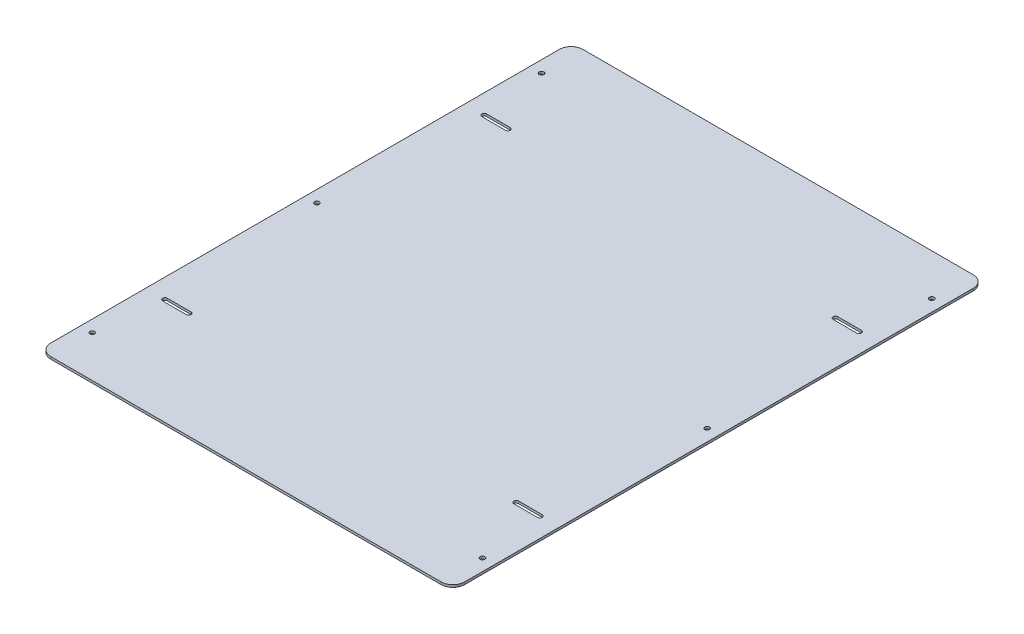
ISO-10303-21;
HEADER;
FILE_DESCRIPTION(('STEP AP214'),'2;1');
FILE_NAME('part.step','',(''),(''),'','','');
FILE_SCHEMA(('AUTOMOTIVE_DESIGN { 1 0 10303 214 1 1 1 1 }'));
ENDSEC;
DATA;
#1=APPLICATION_CONTEXT('core data for automotive mechanical design processes');
#2=APPLICATION_PROTOCOL_DEFINITION('international standard','automotive_design',2000,#1);
#3=PRODUCT_CONTEXT('',#1,'mechanical');
#4=PRODUCT('Part','Part','',(#3));
#5=PRODUCT_RELATED_PRODUCT_CATEGORY('part','',(#4));
#6=PRODUCT_DEFINITION_FORMATION('','',#4);
#7=PRODUCT_DEFINITION_CONTEXT('part definition',#1,'design');
#8=PRODUCT_DEFINITION('design','',#6,#7);
#9=PRODUCT_DEFINITION_SHAPE('','',#8);
#10=(LENGTH_UNIT() NAMED_UNIT(*) SI_UNIT(.MILLI.,.METRE.));
#11=(NAMED_UNIT(*) PLANE_ANGLE_UNIT() SI_UNIT($,.RADIAN.));
#12=(NAMED_UNIT(*) SI_UNIT($,.STERADIAN.) SOLID_ANGLE_UNIT());
#13=UNCERTAINTY_MEASURE_WITH_UNIT(LENGTH_MEASURE(1.E-05),#10,'distance_accuracy_value','');
#14=(GEOMETRIC_REPRESENTATION_CONTEXT(3) GLOBAL_UNCERTAINTY_ASSIGNED_CONTEXT((#13)) GLOBAL_UNIT_ASSIGNED_CONTEXT((#10,
#11,#12)) REPRESENTATION_CONTEXT('',''));
#15=CARTESIAN_POINT('',(0.,0.,0.));
#16=DIRECTION('',(0.,0.,1.));
#17=DIRECTION('',(1.,0.,0.));
#18=AXIS2_PLACEMENT_3D('',#15,#16,#17);
#19=CARTESIAN_POINT('',(-165.,-2.,215.));
#20=DIRECTION('',(0.,1.,0.));
#21=DIRECTION('',(0.,0.,1.));
#22=AXIS2_PLACEMENT_3D('',#19,#20,#21);
#23=CYLINDRICAL_SURFACE('',#22,9.99999999999999);
#24=CARTESIAN_POINT('',(-165.,0.,215.));
#25=DIRECTION('',(0.,1.,0.));
#26=DIRECTION('',(0.,0.,1.));
#27=AXIS2_PLACEMENT_3D('',#24,#25,#26);
#28=CIRCLE('',#27,9.99999999999999);
#29=CARTESIAN_POINT('',(-175.,0.,215.));
#30=VERTEX_POINT('',#29);
#31=CARTESIAN_POINT('',(-165.,0.,225.));
#32=VERTEX_POINT('',#31);
#33=EDGE_CURVE('E364',#30,#32,#28,.T.);
#34=ORIENTED_EDGE('',*,*,#33,.F.);
#35=DIRECTION('',(0.,1.,0.));
#36=VECTOR('',#35,1.);
#37=CARTESIAN_POINT('',(-175.,-2.,215.));
#38=LINE('',#37,#36);
#39=CARTESIAN_POINT('',(-175.,-2.,215.));
#40=VERTEX_POINT('',#39);
#41=EDGE_CURVE('E11',#40,#30,#38,.T.);
#42=ORIENTED_EDGE('',*,*,#41,.F.);
#43=CARTESIAN_POINT('',(-165.,-2.,215.));
#44=DIRECTION('',(0.,1.,0.));
#45=DIRECTION('',(0.,0.,1.));
#46=AXIS2_PLACEMENT_3D('',#43,#44,#45);
#47=CIRCLE('',#46,9.99999999999999);
#48=CARTESIAN_POINT('',(-165.,-2.,225.));
#49=VERTEX_POINT('',#48);
#50=EDGE_CURVE('E367',#40,#49,#47,.T.);
#51=ORIENTED_EDGE('',*,*,#50,.T.);
#52=DIRECTION('',(0.,1.,0.));
#53=VECTOR('',#52,1.);
#54=CARTESIAN_POINT('',(-165.,-2.,225.));
#55=LINE('',#54,#53);
#56=EDGE_CURVE('E40',#49,#32,#55,.T.);
#57=ORIENTED_EDGE('',*,*,#56,.T.);
#58=EDGE_LOOP('',(#34,#42,#51,#57));
#59=FACE_BOUND('',#58,.T.);
#60=ADVANCED_FACE('F37',(#59),#23,.T.);
#61=CARTESIAN_POINT('',(-175.,-2.,-215.));
#62=DIRECTION('',(-1.,0.,0.));
#63=DIRECTION('',(0.,0.,1.));
#64=AXIS2_PLACEMENT_3D('',#61,#62,#63);
#65=PLANE('',#64);
#66=DIRECTION('',(0.,0.,1.));
#67=VECTOR('',#66,1.);
#68=CARTESIAN_POINT('',(-175.,0.,-215.));
#69=LINE('',#68,#67);
#70=CARTESIAN_POINT('',(-175.,0.,-215.));
#71=VERTEX_POINT('',#70);
#72=EDGE_CURVE('E371',#71,#30,#69,.T.);
#73=ORIENTED_EDGE('',*,*,#72,.F.);
#74=DIRECTION('',(0.,1.,0.));
#75=VECTOR('',#74,1.);
#76=CARTESIAN_POINT('',(-175.,-2.,-215.));
#77=LINE('',#76,#75);
#78=CARTESIAN_POINT('',(-175.,-2.,-215.));
#79=VERTEX_POINT('',#78);
#80=EDGE_CURVE('E45',#79,#71,#77,.T.);
#81=ORIENTED_EDGE('',*,*,#80,.F.);
#82=DIRECTION('',(0.,0.,1.));
#83=VECTOR('',#82,1.);
#84=CARTESIAN_POINT('',(-175.,-2.,-215.));
#85=LINE('',#84,#83);
#86=EDGE_CURVE('E389',#79,#40,#85,.T.);
#87=ORIENTED_EDGE('',*,*,#86,.T.);
#88=ORIENTED_EDGE('',*,*,#41,.T.);
#89=EDGE_LOOP('',(#73,#81,#87,#88));
#90=FACE_BOUND('',#89,.T.);
#91=ADVANCED_FACE('F436',(#90),#65,.T.);
#92=CARTESIAN_POINT('',(-165.,-2.,-215.));
#93=DIRECTION('',(0.,1.,0.));
#94=DIRECTION('',(0.,0.,1.));
#95=AXIS2_PLACEMENT_3D('',#92,#93,#94);
#96=CYLINDRICAL_SURFACE('',#95,10.);
#97=CARTESIAN_POINT('',(-165.,0.,-215.));
#98=DIRECTION('',(0.,1.,0.));
#99=DIRECTION('',(0.,0.,1.));
#100=AXIS2_PLACEMENT_3D('',#97,#98,#99);
#101=CIRCLE('',#100,10.);
#102=CARTESIAN_POINT('',(-165.,0.,-225.));
#103=VERTEX_POINT('',#102);
#104=EDGE_CURVE('E409',#103,#71,#101,.T.);
#105=ORIENTED_EDGE('',*,*,#104,.F.);
#106=DIRECTION('',(0.,1.,0.));
#107=VECTOR('',#106,1.);
#108=CARTESIAN_POINT('',(-165.,-2.,-225.));
#109=LINE('',#108,#107);
#110=CARTESIAN_POINT('',(-165.,-2.,-225.));
#111=VERTEX_POINT('',#110);
#112=EDGE_CURVE('E415',#111,#103,#109,.T.);
#113=ORIENTED_EDGE('',*,*,#112,.F.);
#114=CARTESIAN_POINT('',(-165.,-2.,-215.));
#115=DIRECTION('',(0.,1.,0.));
#116=DIRECTION('',(0.,0.,1.));
#117=AXIS2_PLACEMENT_3D('',#114,#115,#116);
#118=CIRCLE('',#117,10.);
#119=EDGE_CURVE('E386',#111,#79,#118,.T.);
#120=ORIENTED_EDGE('',*,*,#119,.T.);
#121=ORIENTED_EDGE('',*,*,#80,.T.);
#122=EDGE_LOOP('',(#105,#113,#120,#121));
#123=FACE_BOUND('',#122,.T.);
#124=ADVANCED_FACE('F456',(#123),#96,.T.);
#125=CARTESIAN_POINT('',(-165.,-2.,-225.));
#126=DIRECTION('',(0.,0.,-1.));
#127=DIRECTION('',(-1.,0.,0.));
#128=AXIS2_PLACEMENT_3D('',#125,#126,#127);
#129=PLANE('',#128);
#130=DIRECTION('',(-1.,0.,0.));
#131=VECTOR('',#130,1.);
#132=CARTESIAN_POINT('',(-165.,0.,-225.));
#133=LINE('',#132,#131);
#134=CARTESIAN_POINT('',(165.,0.,-225.));
#135=VERTEX_POINT('',#134);
#136=EDGE_CURVE('E406',#135,#103,#133,.T.);
#137=ORIENTED_EDGE('',*,*,#136,.F.);
#138=DIRECTION('',(0.,1.,0.));
#139=VECTOR('',#138,1.);
#140=CARTESIAN_POINT('',(165.,-2.,-225.));
#141=LINE('',#140,#139);
#142=CARTESIAN_POINT('',(165.,-2.,-225.));
#143=VERTEX_POINT('',#142);
#144=EDGE_CURVE('E417',#143,#135,#141,.T.);
#145=ORIENTED_EDGE('',*,*,#144,.F.);
#146=DIRECTION('',(-1.,0.,0.));
#147=VECTOR('',#146,1.);
#148=CARTESIAN_POINT('',(-165.,-2.,-225.));
#149=LINE('',#148,#147);
#150=EDGE_CURVE('E383',#143,#111,#149,.T.);
#151=ORIENTED_EDGE('',*,*,#150,.T.);
#152=ORIENTED_EDGE('',*,*,#112,.T.);
#153=EDGE_LOOP('',(#137,#145,#151,#152));
#154=FACE_BOUND('',#153,.T.);
#155=ADVANCED_FACE('F454',(#154),#129,.T.);
#156=CARTESIAN_POINT('',(165.,-2.,-215.));
#157=DIRECTION('',(0.,1.,0.));
#158=DIRECTION('',(0.,0.,1.));
#159=AXIS2_PLACEMENT_3D('',#156,#157,#158);
#160=CYLINDRICAL_SURFACE('',#159,10.);
#161=CARTESIAN_POINT('',(165.,0.,-215.));
#162=DIRECTION('',(0.,1.,0.));
#163=DIRECTION('',(0.,0.,-1.));
#164=AXIS2_PLACEMENT_3D('',#161,#162,#163);
#165=CIRCLE('',#164,10.);
#166=CARTESIAN_POINT('',(175.,0.,-215.));
#167=VERTEX_POINT('',#166);
#168=EDGE_CURVE('E403',#167,#135,#165,.T.);
#169=ORIENTED_EDGE('',*,*,#168,.F.);
#170=DIRECTION('',(0.,1.,0.));
#171=VECTOR('',#170,1.);
#172=CARTESIAN_POINT('',(175.,-2.,-215.));
#173=LINE('',#172,#171);
#174=CARTESIAN_POINT('',(175.,-2.,-215.));
#175=VERTEX_POINT('',#174);
#176=EDGE_CURVE('E419',#175,#167,#173,.T.);
#177=ORIENTED_EDGE('',*,*,#176,.F.);
#178=CARTESIAN_POINT('',(165.,-2.,-215.));
#179=DIRECTION('',(0.,1.,0.));
#180=DIRECTION('',(0.,0.,-1.));
#181=AXIS2_PLACEMENT_3D('',#178,#179,#180);
#182=CIRCLE('',#181,10.);
#183=EDGE_CURVE('E380',#175,#143,#182,.T.);
#184=ORIENTED_EDGE('',*,*,#183,.T.);
#185=ORIENTED_EDGE('',*,*,#144,.T.);
#186=EDGE_LOOP('',(#169,#177,#184,#185));
#187=FACE_BOUND('',#186,.T.);
#188=ADVANCED_FACE('F450',(#187),#160,.T.);
#189=CARTESIAN_POINT('',(175.,-2.,-215.));
#190=DIRECTION('',(1.,0.,0.));
#191=DIRECTION('',(0.,0.,-1.));
#192=AXIS2_PLACEMENT_3D('',#189,#190,#191);
#193=PLANE('',#192);
#194=DIRECTION('',(0.,0.,-1.));
#195=VECTOR('',#194,1.);
#196=CARTESIAN_POINT('',(175.,0.,-215.));
#197=LINE('',#196,#195);
#198=CARTESIAN_POINT('',(175.,0.,215.));
#199=VERTEX_POINT('',#198);
#200=EDGE_CURVE('E400',#199,#167,#197,.T.);
#201=ORIENTED_EDGE('',*,*,#200,.F.);
#202=DIRECTION('',(0.,1.,0.));
#203=VECTOR('',#202,1.);
#204=CARTESIAN_POINT('',(175.,-2.,215.));
#205=LINE('',#204,#203);
#206=CARTESIAN_POINT('',(175.,-2.,215.));
#207=VERTEX_POINT('',#206);
#208=EDGE_CURVE('E421',#207,#199,#205,.T.);
#209=ORIENTED_EDGE('',*,*,#208,.F.);
#210=DIRECTION('',(0.,0.,-1.));
#211=VECTOR('',#210,1.);
#212=CARTESIAN_POINT('',(175.,-2.,-215.));
#213=LINE('',#212,#211);
#214=EDGE_CURVE('E377',#207,#175,#213,.T.);
#215=ORIENTED_EDGE('',*,*,#214,.T.);
#216=ORIENTED_EDGE('',*,*,#176,.T.);
#217=EDGE_LOOP('',(#201,#209,#215,#216));
#218=FACE_BOUND('',#217,.T.);
#219=ADVANCED_FACE('F448',(#218),#193,.T.);
#220=CARTESIAN_POINT('',(165.,-2.,215.));
#221=DIRECTION('',(0.,1.,0.));
#222=DIRECTION('',(0.,0.,1.));
#223=AXIS2_PLACEMENT_3D('',#220,#221,#222);
#224=CYLINDRICAL_SURFACE('',#223,10.);
#225=CARTESIAN_POINT('',(165.,0.,215.));
#226=DIRECTION('',(0.,1.,0.));
#227=DIRECTION('',(0.,0.,1.));
#228=AXIS2_PLACEMENT_3D('',#225,#226,#227);
#229=CIRCLE('',#228,10.);
#230=CARTESIAN_POINT('',(165.,0.,225.));
#231=VERTEX_POINT('',#230);
#232=EDGE_CURVE('E397',#231,#199,#229,.T.);
#233=ORIENTED_EDGE('',*,*,#232,.F.);
#234=DIRECTION('',(0.,1.,0.));
#235=VECTOR('',#234,1.);
#236=CARTESIAN_POINT('',(165.,-2.,225.));
#237=LINE('',#236,#235);
#238=CARTESIAN_POINT('',(165.,-2.,225.));
#239=VERTEX_POINT('',#238);
#240=EDGE_CURVE('E422',#239,#231,#237,.T.);
#241=ORIENTED_EDGE('',*,*,#240,.F.);
#242=CARTESIAN_POINT('',(165.,-2.,215.));
#243=DIRECTION('',(0.,1.,0.));
#244=DIRECTION('',(0.,0.,1.));
#245=AXIS2_PLACEMENT_3D('',#242,#243,#244);
#246=CIRCLE('',#245,10.);
#247=EDGE_CURVE('E374',#239,#207,#246,.T.);
#248=ORIENTED_EDGE('',*,*,#247,.T.);
#249=ORIENTED_EDGE('',*,*,#208,.T.);
#250=EDGE_LOOP('',(#233,#241,#248,#249));
#251=FACE_BOUND('',#250,.T.);
#252=ADVANCED_FACE('F444',(#251),#224,.T.);
#253=CARTESIAN_POINT('',(-165.,-2.,225.));
#254=DIRECTION('',(0.,0.,1.));
#255=DIRECTION('',(1.,0.,0.));
#256=AXIS2_PLACEMENT_3D('',#253,#254,#255);
#257=PLANE('',#256);
#258=DIRECTION('',(1.,0.,0.));
#259=VECTOR('',#258,1.);
#260=CARTESIAN_POINT('',(-165.,0.,225.));
#261=LINE('',#260,#259);
#262=EDGE_CURVE('E394',#32,#231,#261,.T.);
#263=ORIENTED_EDGE('',*,*,#262,.F.);
#264=ORIENTED_EDGE('',*,*,#56,.F.);
#265=DIRECTION('',(1.,0.,0.));
#266=VECTOR('',#265,1.);
#267=CARTESIAN_POINT('',(-165.,-2.,225.));
#268=LINE('',#267,#266);
#269=EDGE_CURVE('E370',#49,#239,#268,.T.);
#270=ORIENTED_EDGE('',*,*,#269,.T.);
#271=ORIENTED_EDGE('',*,*,#240,.T.);
#272=EDGE_LOOP('',(#263,#264,#270,#271));
#273=FACE_BOUND('',#272,.T.);
#274=ADVANCED_FACE('F430',(#273),#257,.T.);
#275=CARTESIAN_POINT('',(-165.,-2.,215.));
#276=DIRECTION('',(0.,1.,0.));
#277=DIRECTION('',(0.,0.,1.));
#278=AXIS2_PLACEMENT_3D('',#275,#276,#277);
#279=PLANE('',#278);
#280=DIRECTION('',(-1.,0.,0.));
#281=VECTOR('',#280,1.);
#282=CARTESIAN_POINT('',(138.5,-2.,133.));
#283=LINE('',#282,#281);
#284=CARTESIAN_POINT('',(158.5,-2.,133.));
#285=VERTEX_POINT('',#284);
#286=CARTESIAN_POINT('',(138.5,-2.,133.));
#287=VERTEX_POINT('',#286);
#288=EDGE_CURVE('E206',#285,#287,#283,.T.);
#289=ORIENTED_EDGE('',*,*,#288,.T.);
#290=CARTESIAN_POINT('',(138.5,-2.,135.));
#291=DIRECTION('',(0.,1.,0.));
#292=DIRECTION('',(0.,0.,-1.));
#293=AXIS2_PLACEMENT_3D('',#290,#291,#292);
#294=CIRCLE('',#293,2.);
#295=CARTESIAN_POINT('',(138.5,-2.,137.));
#296=VERTEX_POINT('',#295);
#297=EDGE_CURVE('E200',#287,#296,#294,.T.);
#298=ORIENTED_EDGE('',*,*,#297,.T.);
#299=DIRECTION('',(1.,0.,0.));
#300=VECTOR('',#299,1.);
#301=CARTESIAN_POINT('',(138.5,-2.,137.));
#302=LINE('',#301,#300);
#303=CARTESIAN_POINT('',(158.5,-2.,137.));
#304=VERTEX_POINT('',#303);
#305=EDGE_CURVE('E209',#296,#304,#302,.T.);
#306=ORIENTED_EDGE('',*,*,#305,.T.);
#307=CARTESIAN_POINT('',(158.5,-2.,135.));
#308=DIRECTION('',(0.,1.,0.));
#309=DIRECTION('',(0.,0.,-1.));
#310=AXIS2_PLACEMENT_3D('',#307,#308,#309);
#311=CIRCLE('',#310,2.);
#312=EDGE_CURVE('E53',#304,#285,#311,.T.);
#313=ORIENTED_EDGE('',*,*,#312,.T.);
#314=EDGE_LOOP('',(#289,#298,#306,#313));
#315=FACE_BOUND('',#314,.T.);
#316=DIRECTION('',(-1.,0.,0.));
#317=VECTOR('',#316,1.);
#318=CARTESIAN_POINT('',(-158.5,-2.,133.));
#319=LINE('',#318,#317);
#320=CARTESIAN_POINT('',(-138.5,-2.,133.));
#321=VERTEX_POINT('',#320);
#322=CARTESIAN_POINT('',(-158.5,-2.,133.));
#323=VERTEX_POINT('',#322);
#324=EDGE_CURVE('E245',#321,#323,#319,.T.);
#325=ORIENTED_EDGE('',*,*,#324,.T.);
#326=CARTESIAN_POINT('',(-158.5,-2.,135.));
#327=DIRECTION('',(0.,1.,0.));
#328=DIRECTION('',(0.,0.,-1.));
#329=AXIS2_PLACEMENT_3D('',#326,#327,#328);
#330=CIRCLE('',#329,1.99999999999997);
#331=CARTESIAN_POINT('',(-158.5,-2.,137.));
#332=VERTEX_POINT('',#331);
#333=EDGE_CURVE('E235',#323,#332,#330,.T.);
#334=ORIENTED_EDGE('',*,*,#333,.T.);
#335=DIRECTION('',(1.,0.,0.));
#336=VECTOR('',#335,1.);
#337=CARTESIAN_POINT('',(-158.5,-2.,137.));
#338=LINE('',#337,#336);
#339=CARTESIAN_POINT('',(-138.5,-2.,137.));
#340=VERTEX_POINT('',#339);
#341=EDGE_CURVE('E238',#332,#340,#338,.T.);
#342=ORIENTED_EDGE('',*,*,#341,.T.);
#343=CARTESIAN_POINT('',(-138.5,-2.,135.));
#344=DIRECTION('',(0.,1.,0.));
#345=DIRECTION('',(0.,0.,-1.));
#346=AXIS2_PLACEMENT_3D('',#343,#344,#345);
#347=CIRCLE('',#346,1.99999999999997);
#348=EDGE_CURVE('E242',#340,#321,#347,.T.);
#349=ORIENTED_EDGE('',*,*,#348,.T.);
#350=EDGE_LOOP('',(#325,#334,#342,#349));
#351=FACE_BOUND('',#350,.T.);
#352=DIRECTION('',(-1.,0.,0.));
#353=VECTOR('',#352,1.);
#354=CARTESIAN_POINT('',(138.5,-2.,-137.));
#355=LINE('',#354,#353);
#356=CARTESIAN_POINT('',(158.5,-2.,-137.));
#357=VERTEX_POINT('',#356);
#358=CARTESIAN_POINT('',(138.5,-2.,-137.));
#359=VERTEX_POINT('',#358);
#360=EDGE_CURVE('E277',#357,#359,#355,.T.);
#361=ORIENTED_EDGE('',*,*,#360,.T.);
#362=CARTESIAN_POINT('',(138.5,-2.,-135.));
#363=DIRECTION('',(0.,1.,0.));
#364=DIRECTION('',(0.,0.,1.));
#365=AXIS2_PLACEMENT_3D('',#362,#363,#364);
#366=CIRCLE('',#365,2.);
#367=CARTESIAN_POINT('',(138.5,-2.,-133.));
#368=VERTEX_POINT('',#367);
#369=EDGE_CURVE('E267',#359,#368,#366,.T.);
#370=ORIENTED_EDGE('',*,*,#369,.T.);
#371=DIRECTION('',(1.,0.,0.));
#372=VECTOR('',#371,1.);
#373=CARTESIAN_POINT('',(138.5,-2.,-133.));
#374=LINE('',#373,#372);
#375=CARTESIAN_POINT('',(158.5,-2.,-133.));
#376=VERTEX_POINT('',#375);
#377=EDGE_CURVE('E270',#368,#376,#374,.T.);
#378=ORIENTED_EDGE('',*,*,#377,.T.);
#379=CARTESIAN_POINT('',(158.5,-2.,-135.));
#380=DIRECTION('',(0.,1.,0.));
#381=DIRECTION('',(0.,0.,1.));
#382=AXIS2_PLACEMENT_3D('',#379,#380,#381);
#383=CIRCLE('',#382,2.);
#384=EDGE_CURVE('E274',#376,#357,#383,.T.);
#385=ORIENTED_EDGE('',*,*,#384,.T.);
#386=EDGE_LOOP('',(#361,#370,#378,#385));
#387=FACE_BOUND('',#386,.T.);
#388=DIRECTION('',(-1.,0.,0.));
#389=VECTOR('',#388,1.);
#390=CARTESIAN_POINT('',(-158.5,-2.,-137.));
#391=LINE('',#390,#389);
#392=CARTESIAN_POINT('',(-138.5,-2.,-137.));
#393=VERTEX_POINT('',#392);
#394=CARTESIAN_POINT('',(-158.5,-2.,-137.));
#395=VERTEX_POINT('',#394);
#396=EDGE_CURVE('E309',#393,#395,#391,.T.);
#397=ORIENTED_EDGE('',*,*,#396,.T.);
#398=CARTESIAN_POINT('',(-158.5,-2.,-135.));
#399=DIRECTION('',(0.,1.,0.));
#400=DIRECTION('',(0.,0.,1.));
#401=AXIS2_PLACEMENT_3D('',#398,#399,#400);
#402=CIRCLE('',#401,1.99999999999997);
#403=CARTESIAN_POINT('',(-158.5,-2.,-133.));
#404=VERTEX_POINT('',#403);
#405=EDGE_CURVE('E299',#395,#404,#402,.T.);
#406=ORIENTED_EDGE('',*,*,#405,.T.);
#407=DIRECTION('',(1.,0.,0.));
#408=VECTOR('',#407,1.);
#409=CARTESIAN_POINT('',(-158.5,-2.,-133.));
#410=LINE('',#409,#408);
#411=CARTESIAN_POINT('',(-138.5,-2.,-133.));
#412=VERTEX_POINT('',#411);
#413=EDGE_CURVE('E302',#404,#412,#410,.T.);
#414=ORIENTED_EDGE('',*,*,#413,.T.);
#415=CARTESIAN_POINT('',(-138.5,-2.,-135.));
#416=DIRECTION('',(0.,1.,0.));
#417=DIRECTION('',(0.,0.,1.));
#418=AXIS2_PLACEMENT_3D('',#415,#416,#417);
#419=CIRCLE('',#418,1.99999999999997);
#420=EDGE_CURVE('E306',#412,#393,#419,.T.);
#421=ORIENTED_EDGE('',*,*,#420,.T.);
#422=EDGE_LOOP('',(#397,#406,#414,#421));
#423=FACE_BOUND('',#422,.T.);
#424=CARTESIAN_POINT('',(-165.,-2.,0.));
#425=DIRECTION('',(0.,1.,0.));
#426=DIRECTION('',(0.,0.,1.));
#427=AXIS2_PLACEMENT_3D('',#424,#425,#426);
#428=CIRCLE('',#427,2.);
#429=CARTESIAN_POINT('',(-165.,-2.,1.99999999999997));
#430=VERTEX_POINT('',#429);
#431=EDGE_CURVE('E331',#430,#430,#428,.T.);
#432=ORIENTED_EDGE('',*,*,#431,.T.);
#433=EDGE_LOOP('',(#432));
#434=FACE_BOUND('',#433,.T.);
#435=CARTESIAN_POINT('',(-165.,-2.,190.));
#436=DIRECTION('',(0.,1.,0.));
#437=DIRECTION('',(0.,0.,1.));
#438=AXIS2_PLACEMENT_3D('',#435,#436,#437);
#439=CIRCLE('',#438,2.);
#440=CARTESIAN_POINT('',(-165.,-2.,192.));
#441=VERTEX_POINT('',#440);
#442=EDGE_CURVE('E337',#441,#441,#439,.T.);
#443=ORIENTED_EDGE('',*,*,#442,.T.);
#444=EDGE_LOOP('',(#443));
#445=FACE_BOUND('',#444,.T.);
#446=CARTESIAN_POINT('',(165.,-2.,190.));
#447=DIRECTION('',(0.,1.,0.));
#448=DIRECTION('',(0.,0.,1.));
#449=AXIS2_PLACEMENT_3D('',#446,#447,#448);
#450=CIRCLE('',#449,2.);
#451=CARTESIAN_POINT('',(165.,-2.,192.));
#452=VERTEX_POINT('',#451);
#453=EDGE_CURVE('E343',#452,#452,#450,.T.);
#454=ORIENTED_EDGE('',*,*,#453,.T.);
#455=EDGE_LOOP('',(#454));
#456=FACE_BOUND('',#455,.T.);
#457=CARTESIAN_POINT('',(165.,-2.,0.));
#458=DIRECTION('',(0.,1.,0.));
#459=DIRECTION('',(0.,0.,1.));
#460=AXIS2_PLACEMENT_3D('',#457,#458,#459);
#461=CIRCLE('',#460,2.);
#462=CARTESIAN_POINT('',(165.,-2.,1.99999999999997));
#463=VERTEX_POINT('',#462);
#464=EDGE_CURVE('E349',#463,#463,#461,.T.);
#465=ORIENTED_EDGE('',*,*,#464,.T.);
#466=EDGE_LOOP('',(#465));
#467=FACE_BOUND('',#466,.T.);
#468=CARTESIAN_POINT('',(165.,-2.,-190.));
#469=DIRECTION('',(0.,1.,0.));
#470=DIRECTION('',(0.,0.,1.));
#471=AXIS2_PLACEMENT_3D('',#468,#469,#470);
#472=CIRCLE('',#471,2.);
#473=CARTESIAN_POINT('',(165.,-2.,-188.));
#474=VERTEX_POINT('',#473);
#475=EDGE_CURVE('E355',#474,#474,#472,.T.);
#476=ORIENTED_EDGE('',*,*,#475,.T.);
#477=EDGE_LOOP('',(#476));
#478=FACE_BOUND('',#477,.T.);
#479=CARTESIAN_POINT('',(-165.,-2.,-190.));
#480=DIRECTION('',(0.,1.,0.));
#481=DIRECTION('',(0.,0.,1.));
#482=AXIS2_PLACEMENT_3D('',#479,#480,#481);
#483=CIRCLE('',#482,2.);
#484=CARTESIAN_POINT('',(-165.,-2.,-188.));
#485=VERTEX_POINT('',#484);
#486=EDGE_CURVE('E361',#485,#485,#483,.T.);
#487=ORIENTED_EDGE('',*,*,#486,.T.);
#488=EDGE_LOOP('',(#487));
#489=FACE_BOUND('',#488,.T.);
#490=ORIENTED_EDGE('',*,*,#50,.F.);
#491=ORIENTED_EDGE('',*,*,#86,.F.);
#492=ORIENTED_EDGE('',*,*,#119,.F.);
#493=ORIENTED_EDGE('',*,*,#150,.F.);
#494=ORIENTED_EDGE('',*,*,#183,.F.);
#495=ORIENTED_EDGE('',*,*,#214,.F.);
#496=ORIENTED_EDGE('',*,*,#247,.F.);
#497=ORIENTED_EDGE('',*,*,#269,.F.);
#498=EDGE_LOOP('',(#490,#491,#492,#493,#494,#495,#496,#497));
#499=FACE_BOUND('',#498,.T.);
#500=ADVANCED_FACE('F213',(#315,#351,#387,#423,#434,#445,#456,#467,#478,#489,#499),#279,.F.);
#501=CARTESIAN_POINT('',(-165.,0.,215.));
#502=DIRECTION('',(0.,1.,0.));
#503=DIRECTION('',(0.,0.,1.));
#504=AXIS2_PLACEMENT_3D('',#501,#502,#503);
#505=PLANE('',#504);
#506=CARTESIAN_POINT('',(138.5,0.,135.));
#507=DIRECTION('',(0.,1.,0.));
#508=DIRECTION('',(0.,0.,-1.));
#509=AXIS2_PLACEMENT_3D('',#506,#507,#508);
#510=CIRCLE('',#509,2.);
#511=CARTESIAN_POINT('',(138.5,0.,133.));
#512=VERTEX_POINT('',#511);
#513=CARTESIAN_POINT('',(138.5,0.,137.));
#514=VERTEX_POINT('',#513);
#515=EDGE_CURVE('E61',#512,#514,#510,.T.);
#516=ORIENTED_EDGE('',*,*,#515,.F.);
#517=DIRECTION('',(-1.,0.,0.));
#518=VECTOR('',#517,1.);
#519=CARTESIAN_POINT('',(138.5,0.,133.));
#520=LINE('',#519,#518);
#521=CARTESIAN_POINT('',(158.5,0.,133.));
#522=VERTEX_POINT('',#521);
#523=EDGE_CURVE('E216',#522,#512,#520,.T.);
#524=ORIENTED_EDGE('',*,*,#523,.F.);
#525=CARTESIAN_POINT('',(158.5,0.,135.));
#526=DIRECTION('',(0.,1.,0.));
#527=DIRECTION('',(0.,0.,-1.));
#528=AXIS2_PLACEMENT_3D('',#525,#526,#527);
#529=CIRCLE('',#528,2.);
#530=CARTESIAN_POINT('',(158.5,0.,137.));
#531=VERTEX_POINT('',#530);
#532=EDGE_CURVE('E219',#531,#522,#529,.T.);
#533=ORIENTED_EDGE('',*,*,#532,.F.);
#534=DIRECTION('',(1.,0.,0.));
#535=VECTOR('',#534,1.);
#536=CARTESIAN_POINT('',(138.5,0.,137.));
#537=LINE('',#536,#535);
#538=EDGE_CURVE('E225',#514,#531,#537,.T.);
#539=ORIENTED_EDGE('',*,*,#538,.F.);
#540=EDGE_LOOP('',(#516,#524,#533,#539));
#541=FACE_BOUND('',#540,.T.);
#542=CARTESIAN_POINT('',(-158.5,0.,135.));
#543=DIRECTION('',(0.,1.,0.));
#544=DIRECTION('',(0.,0.,-1.));
#545=AXIS2_PLACEMENT_3D('',#542,#543,#544);
#546=CIRCLE('',#545,1.99999999999997);
#547=CARTESIAN_POINT('',(-158.5,0.,133.));
#548=VERTEX_POINT('',#547);
#549=CARTESIAN_POINT('',(-158.5,0.,137.));
#550=VERTEX_POINT('',#549);
#551=EDGE_CURVE('E231',#548,#550,#546,.T.);
#552=ORIENTED_EDGE('',*,*,#551,.F.);
#553=DIRECTION('',(-1.,0.,0.));
#554=VECTOR('',#553,1.);
#555=CARTESIAN_POINT('',(-158.5,0.,133.));
#556=LINE('',#555,#554);
#557=CARTESIAN_POINT('',(-138.5,0.,133.));
#558=VERTEX_POINT('',#557);
#559=EDGE_CURVE('E239',#558,#548,#556,.T.);
#560=ORIENTED_EDGE('',*,*,#559,.F.);
#561=CARTESIAN_POINT('',(-138.5,0.,135.));
#562=DIRECTION('',(0.,1.,0.));
#563=DIRECTION('',(0.,0.,-1.));
#564=AXIS2_PLACEMENT_3D('',#561,#562,#563);
#565=CIRCLE('',#564,1.99999999999997);
#566=CARTESIAN_POINT('',(-138.5,0.,137.));
#567=VERTEX_POINT('',#566);
#568=EDGE_CURVE('E253',#567,#558,#565,.T.);
#569=ORIENTED_EDGE('',*,*,#568,.F.);
#570=DIRECTION('',(1.,0.,0.));
#571=VECTOR('',#570,1.);
#572=CARTESIAN_POINT('',(-158.5,0.,137.));
#573=LINE('',#572,#571);
#574=EDGE_CURVE('E250',#550,#567,#573,.T.);
#575=ORIENTED_EDGE('',*,*,#574,.F.);
#576=EDGE_LOOP('',(#552,#560,#569,#575));
#577=FACE_BOUND('',#576,.T.);
#578=CARTESIAN_POINT('',(138.5,0.,-135.));
#579=DIRECTION('',(0.,1.,0.));
#580=DIRECTION('',(0.,0.,1.));
#581=AXIS2_PLACEMENT_3D('',#578,#579,#580);
#582=CIRCLE('',#581,2.);
#583=CARTESIAN_POINT('',(138.5,0.,-137.));
#584=VERTEX_POINT('',#583);
#585=CARTESIAN_POINT('',(138.5,0.,-133.));
#586=VERTEX_POINT('',#585);
#587=EDGE_CURVE('E260',#584,#586,#582,.T.);
#588=ORIENTED_EDGE('',*,*,#587,.F.);
#589=DIRECTION('',(-1.,0.,0.));
#590=VECTOR('',#589,1.);
#591=CARTESIAN_POINT('',(138.5,0.,-137.));
#592=LINE('',#591,#590);
#593=CARTESIAN_POINT('',(158.5,0.,-137.));
#594=VERTEX_POINT('',#593);
#595=EDGE_CURVE('E271',#594,#584,#592,.T.);
#596=ORIENTED_EDGE('',*,*,#595,.F.);
#597=CARTESIAN_POINT('',(158.5,0.,-135.));
#598=DIRECTION('',(0.,1.,0.));
#599=DIRECTION('',(0.,0.,1.));
#600=AXIS2_PLACEMENT_3D('',#597,#598,#599);
#601=CIRCLE('',#600,2.);
#602=CARTESIAN_POINT('',(158.5,0.,-133.));
#603=VERTEX_POINT('',#602);
#604=EDGE_CURVE('E285',#603,#594,#601,.T.);
#605=ORIENTED_EDGE('',*,*,#604,.F.);
#606=DIRECTION('',(1.,0.,0.));
#607=VECTOR('',#606,1.);
#608=CARTESIAN_POINT('',(138.5,0.,-133.));
#609=LINE('',#608,#607);
#610=EDGE_CURVE('E282',#586,#603,#609,.T.);
#611=ORIENTED_EDGE('',*,*,#610,.F.);
#612=EDGE_LOOP('',(#588,#596,#605,#611));
#613=FACE_BOUND('',#612,.T.);
#614=CARTESIAN_POINT('',(-158.5,0.,-135.));
#615=DIRECTION('',(0.,1.,0.));
#616=DIRECTION('',(0.,0.,1.));
#617=AXIS2_PLACEMENT_3D('',#614,#615,#616);
#618=CIRCLE('',#617,1.99999999999997);
#619=CARTESIAN_POINT('',(-158.5,0.,-137.));
#620=VERTEX_POINT('',#619);
#621=CARTESIAN_POINT('',(-158.5,0.,-133.));
#622=VERTEX_POINT('',#621);
#623=EDGE_CURVE('E292',#620,#622,#618,.T.);
#624=ORIENTED_EDGE('',*,*,#623,.F.);
#625=DIRECTION('',(-1.,0.,0.));
#626=VECTOR('',#625,1.);
#627=CARTESIAN_POINT('',(-158.5,0.,-137.));
#628=LINE('',#627,#626);
#629=CARTESIAN_POINT('',(-138.5,0.,-137.));
#630=VERTEX_POINT('',#629);
#631=EDGE_CURVE('E303',#630,#620,#628,.T.);
#632=ORIENTED_EDGE('',*,*,#631,.F.);
#633=CARTESIAN_POINT('',(-138.5,0.,-135.));
#634=DIRECTION('',(0.,1.,0.));
#635=DIRECTION('',(0.,0.,1.));
#636=AXIS2_PLACEMENT_3D('',#633,#634,#635);
#637=CIRCLE('',#636,1.99999999999997);
#638=CARTESIAN_POINT('',(-138.5,0.,-133.));
#639=VERTEX_POINT('',#638);
#640=EDGE_CURVE('E317',#639,#630,#637,.T.);
#641=ORIENTED_EDGE('',*,*,#640,.F.);
#642=DIRECTION('',(1.,0.,0.));
#643=VECTOR('',#642,1.);
#644=CARTESIAN_POINT('',(-158.5,0.,-133.));
#645=LINE('',#644,#643);
#646=EDGE_CURVE('E314',#622,#639,#645,.T.);
#647=ORIENTED_EDGE('',*,*,#646,.F.);
#648=EDGE_LOOP('',(#624,#632,#641,#647));
#649=FACE_BOUND('',#648,.T.);
#650=CARTESIAN_POINT('',(-165.,0.,0.));
#651=DIRECTION('',(0.,1.,0.));
#652=DIRECTION('',(0.,0.,1.));
#653=AXIS2_PLACEMENT_3D('',#650,#651,#652);
#654=CIRCLE('',#653,2.);
#655=CARTESIAN_POINT('',(-165.,0.,1.99999999999997));
#656=VERTEX_POINT('',#655);
#657=EDGE_CURVE('E324',#656,#656,#654,.T.);
#658=ORIENTED_EDGE('',*,*,#657,.F.);
#659=EDGE_LOOP('',(#658));
#660=FACE_BOUND('',#659,.T.);
#661=CARTESIAN_POINT('',(-165.,0.,190.));
#662=DIRECTION('',(0.,1.,0.));
#663=DIRECTION('',(0.,0.,1.));
#664=AXIS2_PLACEMENT_3D('',#661,#662,#663);
#665=CIRCLE('',#664,2.);
#666=CARTESIAN_POINT('',(-165.,0.,192.));
#667=VERTEX_POINT('',#666);
#668=EDGE_CURVE('E334',#667,#667,#665,.T.);
#669=ORIENTED_EDGE('',*,*,#668,.F.);
#670=EDGE_LOOP('',(#669));
#671=FACE_BOUND('',#670,.T.);
#672=CARTESIAN_POINT('',(165.,0.,190.));
#673=DIRECTION('',(0.,1.,0.));
#674=DIRECTION('',(0.,0.,1.));
#675=AXIS2_PLACEMENT_3D('',#672,#673,#674);
#676=CIRCLE('',#675,2.);
#677=CARTESIAN_POINT('',(165.,0.,192.));
#678=VERTEX_POINT('',#677);
#679=EDGE_CURVE('E340',#678,#678,#676,.T.);
#680=ORIENTED_EDGE('',*,*,#679,.F.);
#681=EDGE_LOOP('',(#680));
#682=FACE_BOUND('',#681,.T.);
#683=CARTESIAN_POINT('',(165.,0.,0.));
#684=DIRECTION('',(0.,1.,0.));
#685=DIRECTION('',(0.,0.,1.));
#686=AXIS2_PLACEMENT_3D('',#683,#684,#685);
#687=CIRCLE('',#686,2.);
#688=CARTESIAN_POINT('',(165.,0.,1.99999999999997));
#689=VERTEX_POINT('',#688);
#690=EDGE_CURVE('E346',#689,#689,#687,.T.);
#691=ORIENTED_EDGE('',*,*,#690,.F.);
#692=EDGE_LOOP('',(#691));
#693=FACE_BOUND('',#692,.T.);
#694=CARTESIAN_POINT('',(165.,0.,-190.));
#695=DIRECTION('',(0.,1.,0.));
#696=DIRECTION('',(0.,0.,1.));
#697=AXIS2_PLACEMENT_3D('',#694,#695,#696);
#698=CIRCLE('',#697,2.);
#699=CARTESIAN_POINT('',(165.,0.,-188.));
#700=VERTEX_POINT('',#699);
#701=EDGE_CURVE('E352',#700,#700,#698,.T.);
#702=ORIENTED_EDGE('',*,*,#701,.F.);
#703=EDGE_LOOP('',(#702));
#704=FACE_BOUND('',#703,.T.);
#705=CARTESIAN_POINT('',(-165.,0.,-190.));
#706=DIRECTION('',(0.,1.,0.));
#707=DIRECTION('',(0.,0.,1.));
#708=AXIS2_PLACEMENT_3D('',#705,#706,#707);
#709=CIRCLE('',#708,2.);
#710=CARTESIAN_POINT('',(-165.,0.,-188.));
#711=VERTEX_POINT('',#710);
#712=EDGE_CURVE('E358',#711,#711,#709,.T.);
#713=ORIENTED_EDGE('',*,*,#712,.F.);
#714=EDGE_LOOP('',(#713));
#715=FACE_BOUND('',#714,.T.);
#716=ORIENTED_EDGE('',*,*,#33,.T.);
#717=ORIENTED_EDGE('',*,*,#262,.T.);
#718=ORIENTED_EDGE('',*,*,#232,.T.);
#719=ORIENTED_EDGE('',*,*,#200,.T.);
#720=ORIENTED_EDGE('',*,*,#168,.T.);
#721=ORIENTED_EDGE('',*,*,#136,.T.);
#722=ORIENTED_EDGE('',*,*,#104,.T.);
#723=ORIENTED_EDGE('',*,*,#72,.T.);
#724=EDGE_LOOP('',(#716,#717,#718,#719,#720,#721,#722,#723));
#725=FACE_BOUND('',#724,.T.);
#726=ADVANCED_FACE('F432',(#541,#577,#613,#649,#660,#671,#682,#693,#704,#715,#725),#505,.T.);
#727=CARTESIAN_POINT('',(-165.,-2.,-190.));
#728=DIRECTION('',(0.,1.,0.));
#729=DIRECTION('',(0.,0.,1.));
#730=AXIS2_PLACEMENT_3D('',#727,#728,#729);
#731=CYLINDRICAL_SURFACE('',#730,2.);
#732=ORIENTED_EDGE('',*,*,#486,.F.);
#733=EDGE_LOOP('',(#732));
#734=FACE_BOUND('',#733,.T.);
#735=ORIENTED_EDGE('',*,*,#712,.T.);
#736=EDGE_LOOP('',(#735));
#737=FACE_BOUND('',#736,.T.);
#738=ADVANCED_FACE('F538',(#734,#737),#731,.F.);
#739=CARTESIAN_POINT('',(165.,-2.,-190.));
#740=DIRECTION('',(0.,1.,0.));
#741=DIRECTION('',(0.,0.,1.));
#742=AXIS2_PLACEMENT_3D('',#739,#740,#741);
#743=CYLINDRICAL_SURFACE('',#742,2.);
#744=ORIENTED_EDGE('',*,*,#475,.F.);
#745=EDGE_LOOP('',(#744));
#746=FACE_BOUND('',#745,.T.);
#747=ORIENTED_EDGE('',*,*,#701,.T.);
#748=EDGE_LOOP('',(#747));
#749=FACE_BOUND('',#748,.T.);
#750=ADVANCED_FACE('F549',(#746,#749),#743,.F.);
#751=CARTESIAN_POINT('',(165.,-2.,0.));
#752=DIRECTION('',(0.,1.,0.));
#753=DIRECTION('',(0.,0.,1.));
#754=AXIS2_PLACEMENT_3D('',#751,#752,#753);
#755=CYLINDRICAL_SURFACE('',#754,2.);
#756=ORIENTED_EDGE('',*,*,#464,.F.);
#757=EDGE_LOOP('',(#756));
#758=FACE_BOUND('',#757,.T.);
#759=ORIENTED_EDGE('',*,*,#690,.T.);
#760=EDGE_LOOP('',(#759));
#761=FACE_BOUND('',#760,.T.);
#762=ADVANCED_FACE('F560',(#758,#761),#755,.F.);
#763=CARTESIAN_POINT('',(165.,-2.,190.));
#764=DIRECTION('',(0.,1.,0.));
#765=DIRECTION('',(0.,0.,1.));
#766=AXIS2_PLACEMENT_3D('',#763,#764,#765);
#767=CYLINDRICAL_SURFACE('',#766,2.);
#768=ORIENTED_EDGE('',*,*,#453,.F.);
#769=EDGE_LOOP('',(#768));
#770=FACE_BOUND('',#769,.T.);
#771=ORIENTED_EDGE('',*,*,#679,.T.);
#772=EDGE_LOOP('',(#771));
#773=FACE_BOUND('',#772,.T.);
#774=ADVANCED_FACE('F571',(#770,#773),#767,.F.);
#775=CARTESIAN_POINT('',(-165.,-2.,190.));
#776=DIRECTION('',(0.,1.,0.));
#777=DIRECTION('',(0.,0.,1.));
#778=AXIS2_PLACEMENT_3D('',#775,#776,#777);
#779=CYLINDRICAL_SURFACE('',#778,2.);
#780=ORIENTED_EDGE('',*,*,#442,.F.);
#781=EDGE_LOOP('',(#780));
#782=FACE_BOUND('',#781,.T.);
#783=ORIENTED_EDGE('',*,*,#668,.T.);
#784=EDGE_LOOP('',(#783));
#785=FACE_BOUND('',#784,.T.);
#786=ADVANCED_FACE('F582',(#782,#785),#779,.F.);
#787=CARTESIAN_POINT('',(-165.,-2.,0.));
#788=DIRECTION('',(0.,1.,0.));
#789=DIRECTION('',(0.,0.,1.));
#790=AXIS2_PLACEMENT_3D('',#787,#788,#789);
#791=CYLINDRICAL_SURFACE('',#790,2.);
#792=ORIENTED_EDGE('',*,*,#431,.F.);
#793=EDGE_LOOP('',(#792));
#794=FACE_BOUND('',#793,.T.);
#795=ORIENTED_EDGE('',*,*,#657,.T.);
#796=EDGE_LOOP('',(#795));
#797=FACE_BOUND('',#796,.T.);
#798=ADVANCED_FACE('F593',(#794,#797),#791,.F.);
#799=CARTESIAN_POINT('',(-158.5,-2.,-135.));
#800=DIRECTION('',(0.,1.,0.));
#801=DIRECTION('',(0.,0.,1.));
#802=AXIS2_PLACEMENT_3D('',#799,#800,#801);
#803=CYLINDRICAL_SURFACE('',#802,1.99999999999997);
#804=ORIENTED_EDGE('',*,*,#623,.T.);
#805=DIRECTION('',(0.,1.,0.));
#806=VECTOR('',#805,1.);
#807=CARTESIAN_POINT('',(-158.5,-2.,-133.));
#808=LINE('',#807,#806);
#809=EDGE_CURVE('E312',#404,#622,#808,.T.);
#810=ORIENTED_EDGE('',*,*,#809,.F.);
#811=ORIENTED_EDGE('',*,*,#405,.F.);
#812=DIRECTION('',(0.,1.,0.));
#813=VECTOR('',#812,1.);
#814=CARTESIAN_POINT('',(-158.5,-2.,-137.));
#815=LINE('',#814,#813);
#816=EDGE_CURVE('E322',#395,#620,#815,.T.);
#817=ORIENTED_EDGE('',*,*,#816,.T.);
#818=EDGE_LOOP('',(#804,#810,#811,#817));
#819=FACE_BOUND('',#818,.T.);
#820=ADVANCED_FACE('F604',(#819),#803,.F.);
#821=CARTESIAN_POINT('',(-158.5,-2.,-137.));
#822=DIRECTION('',(0.,0.,-1.));
#823=DIRECTION('',(-1.,0.,0.));
#824=AXIS2_PLACEMENT_3D('',#821,#822,#823);
#825=PLANE('',#824);
#826=ORIENTED_EDGE('',*,*,#631,.T.);
#827=ORIENTED_EDGE('',*,*,#816,.F.);
#828=ORIENTED_EDGE('',*,*,#396,.F.);
#829=DIRECTION('',(0.,1.,0.));
#830=VECTOR('',#829,1.);
#831=CARTESIAN_POINT('',(-138.5,-2.,-137.));
#832=LINE('',#831,#830);
#833=EDGE_CURVE('E325',#393,#630,#832,.T.);
#834=ORIENTED_EDGE('',*,*,#833,.T.);
#835=EDGE_LOOP('',(#826,#827,#828,#834));
#836=FACE_BOUND('',#835,.T.);
#837=ADVANCED_FACE('F615',(#836),#825,.F.);
#838=CARTESIAN_POINT('',(-138.5,-2.,-135.));
#839=DIRECTION('',(0.,1.,0.));
#840=DIRECTION('',(0.,0.,1.));
#841=AXIS2_PLACEMENT_3D('',#838,#839,#840);
#842=CYLINDRICAL_SURFACE('',#841,1.99999999999997);
#843=ORIENTED_EDGE('',*,*,#640,.T.);
#844=ORIENTED_EDGE('',*,*,#833,.F.);
#845=ORIENTED_EDGE('',*,*,#420,.F.);
#846=DIRECTION('',(0.,1.,0.));
#847=VECTOR('',#846,1.);
#848=CARTESIAN_POINT('',(-138.5,-2.,-133.));
#849=LINE('',#848,#847);
#850=EDGE_CURVE('E327',#412,#639,#849,.T.);
#851=ORIENTED_EDGE('',*,*,#850,.T.);
#852=EDGE_LOOP('',(#843,#844,#845,#851));
#853=FACE_BOUND('',#852,.T.);
#854=ADVANCED_FACE('F626',(#853),#842,.F.);
#855=CARTESIAN_POINT('',(-158.5,-2.,-133.));
#856=DIRECTION('',(0.,0.,1.));
#857=DIRECTION('',(1.,0.,0.));
#858=AXIS2_PLACEMENT_3D('',#855,#856,#857);
#859=PLANE('',#858);
#860=ORIENTED_EDGE('',*,*,#646,.T.);
#861=ORIENTED_EDGE('',*,*,#850,.F.);
#862=ORIENTED_EDGE('',*,*,#413,.F.);
#863=ORIENTED_EDGE('',*,*,#809,.T.);
#864=EDGE_LOOP('',(#860,#861,#862,#863));
#865=FACE_BOUND('',#864,.T.);
#866=ADVANCED_FACE('F637',(#865),#859,.F.);
#867=CARTESIAN_POINT('',(138.5,-2.,-135.));
#868=DIRECTION('',(0.,1.,0.));
#869=DIRECTION('',(0.,0.,1.));
#870=AXIS2_PLACEMENT_3D('',#867,#868,#869);
#871=CYLINDRICAL_SURFACE('',#870,2.);
#872=ORIENTED_EDGE('',*,*,#587,.T.);
#873=DIRECTION('',(0.,1.,0.));
#874=VECTOR('',#873,1.);
#875=CARTESIAN_POINT('',(138.5,-2.,-133.));
#876=LINE('',#875,#874);
#877=EDGE_CURVE('E280',#368,#586,#876,.T.);
#878=ORIENTED_EDGE('',*,*,#877,.F.);
#879=ORIENTED_EDGE('',*,*,#369,.F.);
#880=DIRECTION('',(0.,1.,0.));
#881=VECTOR('',#880,1.);
#882=CARTESIAN_POINT('',(138.5,-2.,-137.));
#883=LINE('',#882,#881);
#884=EDGE_CURVE('E290',#359,#584,#883,.T.);
#885=ORIENTED_EDGE('',*,*,#884,.T.);
#886=EDGE_LOOP('',(#872,#878,#879,#885));
#887=FACE_BOUND('',#886,.T.);
#888=ADVANCED_FACE('F648',(#887),#871,.F.);
#889=CARTESIAN_POINT('',(138.5,-2.,-137.));
#890=DIRECTION('',(0.,0.,-1.));
#891=DIRECTION('',(-1.,0.,0.));
#892=AXIS2_PLACEMENT_3D('',#889,#890,#891);
#893=PLANE('',#892);
#894=ORIENTED_EDGE('',*,*,#595,.T.);
#895=ORIENTED_EDGE('',*,*,#884,.F.);
#896=ORIENTED_EDGE('',*,*,#360,.F.);
#897=DIRECTION('',(0.,1.,0.));
#898=VECTOR('',#897,1.);
#899=CARTESIAN_POINT('',(158.5,-2.,-137.));
#900=LINE('',#899,#898);
#901=EDGE_CURVE('E293',#357,#594,#900,.T.);
#902=ORIENTED_EDGE('',*,*,#901,.T.);
#903=EDGE_LOOP('',(#894,#895,#896,#902));
#904=FACE_BOUND('',#903,.T.);
#905=ADVANCED_FACE('F659',(#904),#893,.F.);
#906=CARTESIAN_POINT('',(158.5,-2.,-135.));
#907=DIRECTION('',(0.,1.,0.));
#908=DIRECTION('',(0.,0.,1.));
#909=AXIS2_PLACEMENT_3D('',#906,#907,#908);
#910=CYLINDRICAL_SURFACE('',#909,2.);
#911=ORIENTED_EDGE('',*,*,#604,.T.);
#912=ORIENTED_EDGE('',*,*,#901,.F.);
#913=ORIENTED_EDGE('',*,*,#384,.F.);
#914=DIRECTION('',(0.,1.,0.));
#915=VECTOR('',#914,1.);
#916=CARTESIAN_POINT('',(158.5,-2.,-133.));
#917=LINE('',#916,#915);
#918=EDGE_CURVE('E295',#376,#603,#917,.T.);
#919=ORIENTED_EDGE('',*,*,#918,.T.);
#920=EDGE_LOOP('',(#911,#912,#913,#919));
#921=FACE_BOUND('',#920,.T.);
#922=ADVANCED_FACE('F670',(#921),#910,.F.);
#923=CARTESIAN_POINT('',(138.5,-2.,-133.));
#924=DIRECTION('',(0.,0.,1.));
#925=DIRECTION('',(1.,0.,0.));
#926=AXIS2_PLACEMENT_3D('',#923,#924,#925);
#927=PLANE('',#926);
#928=ORIENTED_EDGE('',*,*,#610,.T.);
#929=ORIENTED_EDGE('',*,*,#918,.F.);
#930=ORIENTED_EDGE('',*,*,#377,.F.);
#931=ORIENTED_EDGE('',*,*,#877,.T.);
#932=EDGE_LOOP('',(#928,#929,#930,#931));
#933=FACE_BOUND('',#932,.T.);
#934=ADVANCED_FACE('F681',(#933),#927,.F.);
#935=CARTESIAN_POINT('',(-158.5,-2.,135.));
#936=DIRECTION('',(0.,1.,0.));
#937=DIRECTION('',(0.,0.,1.));
#938=AXIS2_PLACEMENT_3D('',#935,#936,#937);
#939=CYLINDRICAL_SURFACE('',#938,1.99999999999997);
#940=ORIENTED_EDGE('',*,*,#551,.T.);
#941=DIRECTION('',(0.,1.,0.));
#942=VECTOR('',#941,1.);
#943=CARTESIAN_POINT('',(-158.5,-2.,137.));
#944=LINE('',#943,#942);
#945=EDGE_CURVE('E248',#332,#550,#944,.T.);
#946=ORIENTED_EDGE('',*,*,#945,.F.);
#947=ORIENTED_EDGE('',*,*,#333,.F.);
#948=DIRECTION('',(0.,1.,0.));
#949=VECTOR('',#948,1.);
#950=CARTESIAN_POINT('',(-158.5,-2.,133.));
#951=LINE('',#950,#949);
#952=EDGE_CURVE('E258',#323,#548,#951,.T.);
#953=ORIENTED_EDGE('',*,*,#952,.T.);
#954=EDGE_LOOP('',(#940,#946,#947,#953));
#955=FACE_BOUND('',#954,.T.);
#956=ADVANCED_FACE('F692',(#955),#939,.F.);
#957=CARTESIAN_POINT('',(-158.5,-2.,133.));
#958=DIRECTION('',(0.,0.,-1.));
#959=DIRECTION('',(-1.,0.,0.));
#960=AXIS2_PLACEMENT_3D('',#957,#958,#959);
#961=PLANE('',#960);
#962=ORIENTED_EDGE('',*,*,#559,.T.);
#963=ORIENTED_EDGE('',*,*,#952,.F.);
#964=ORIENTED_EDGE('',*,*,#324,.F.);
#965=DIRECTION('',(0.,1.,0.));
#966=VECTOR('',#965,1.);
#967=CARTESIAN_POINT('',(-138.5,-2.,133.));
#968=LINE('',#967,#966);
#969=EDGE_CURVE('E261',#321,#558,#968,.T.);
#970=ORIENTED_EDGE('',*,*,#969,.T.);
#971=EDGE_LOOP('',(#962,#963,#964,#970));
#972=FACE_BOUND('',#971,.T.);
#973=ADVANCED_FACE('F703',(#972),#961,.F.);
#974=CARTESIAN_POINT('',(-138.5,-2.,135.));
#975=DIRECTION('',(0.,1.,0.));
#976=DIRECTION('',(0.,0.,1.));
#977=AXIS2_PLACEMENT_3D('',#974,#975,#976);
#978=CYLINDRICAL_SURFACE('',#977,1.99999999999997);
#979=ORIENTED_EDGE('',*,*,#568,.T.);
#980=ORIENTED_EDGE('',*,*,#969,.F.);
#981=ORIENTED_EDGE('',*,*,#348,.F.);
#982=DIRECTION('',(0.,1.,0.));
#983=VECTOR('',#982,1.);
#984=CARTESIAN_POINT('',(-138.5,-2.,137.));
#985=LINE('',#984,#983);
#986=EDGE_CURVE('E263',#340,#567,#985,.T.);
#987=ORIENTED_EDGE('',*,*,#986,.T.);
#988=EDGE_LOOP('',(#979,#980,#981,#987));
#989=FACE_BOUND('',#988,.T.);
#990=ADVANCED_FACE('F714',(#989),#978,.F.);
#991=CARTESIAN_POINT('',(-158.5,-2.,137.));
#992=DIRECTION('',(0.,0.,1.));
#993=DIRECTION('',(1.,0.,0.));
#994=AXIS2_PLACEMENT_3D('',#991,#992,#993);
#995=PLANE('',#994);
#996=ORIENTED_EDGE('',*,*,#574,.T.);
#997=ORIENTED_EDGE('',*,*,#986,.F.);
#998=ORIENTED_EDGE('',*,*,#341,.F.);
#999=ORIENTED_EDGE('',*,*,#945,.T.);
#1000=EDGE_LOOP('',(#996,#997,#998,#999));
#1001=FACE_BOUND('',#1000,.T.);
#1002=ADVANCED_FACE('F725',(#1001),#995,.F.);
#1003=CARTESIAN_POINT('',(138.5,-2.,135.));
#1004=DIRECTION('',(0.,1.,0.));
#1005=DIRECTION('',(0.,0.,1.));
#1006=AXIS2_PLACEMENT_3D('',#1003,#1004,#1005);
#1007=CYLINDRICAL_SURFACE('',#1006,2.);
#1008=ORIENTED_EDGE('',*,*,#515,.T.);
#1009=DIRECTION('',(0.,1.,0.));
#1010=VECTOR('',#1009,1.);
#1011=CARTESIAN_POINT('',(138.5,-2.,137.));
#1012=LINE('',#1011,#1010);
#1013=EDGE_CURVE('E196',#296,#514,#1012,.T.);
#1014=ORIENTED_EDGE('',*,*,#1013,.F.);
#1015=ORIENTED_EDGE('',*,*,#297,.F.);
#1016=DIRECTION('',(0.,1.,0.));
#1017=VECTOR('',#1016,1.);
#1018=CARTESIAN_POINT('',(138.5,-2.,133.));
#1019=LINE('',#1018,#1017);
#1020=EDGE_CURVE('E229',#287,#512,#1019,.T.);
#1021=ORIENTED_EDGE('',*,*,#1020,.T.);
#1022=EDGE_LOOP('',(#1008,#1014,#1015,#1021));
#1023=FACE_BOUND('',#1022,.T.);
#1024=ADVANCED_FACE('F198',(#1023),#1007,.F.);
#1025=CARTESIAN_POINT('',(138.5,-2.,133.));
#1026=DIRECTION('',(0.,0.,-1.));
#1027=DIRECTION('',(-1.,0.,0.));
#1028=AXIS2_PLACEMENT_3D('',#1025,#1026,#1027);
#1029=PLANE('',#1028);
#1030=ORIENTED_EDGE('',*,*,#523,.T.);
#1031=ORIENTED_EDGE('',*,*,#1020,.F.);
#1032=ORIENTED_EDGE('',*,*,#288,.F.);
#1033=DIRECTION('',(0.,1.,0.));
#1034=VECTOR('',#1033,1.);
#1035=CARTESIAN_POINT('',(158.5,-2.,133.));
#1036=LINE('',#1035,#1034);
#1037=EDGE_CURVE('E232',#285,#522,#1036,.T.);
#1038=ORIENTED_EDGE('',*,*,#1037,.T.);
#1039=EDGE_LOOP('',(#1030,#1031,#1032,#1038));
#1040=FACE_BOUND('',#1039,.T.);
#1041=ADVANCED_FACE('F746',(#1040),#1029,.F.);
#1042=CARTESIAN_POINT('',(158.5,-2.,135.));
#1043=DIRECTION('',(0.,1.,0.));
#1044=DIRECTION('',(0.,0.,1.));
#1045=AXIS2_PLACEMENT_3D('',#1042,#1043,#1044);
#1046=CYLINDRICAL_SURFACE('',#1045,2.);
#1047=ORIENTED_EDGE('',*,*,#532,.T.);
#1048=ORIENTED_EDGE('',*,*,#1037,.F.);
#1049=ORIENTED_EDGE('',*,*,#312,.F.);
#1050=DIRECTION('',(0.,1.,0.));
#1051=VECTOR('',#1050,1.);
#1052=CARTESIAN_POINT('',(158.5,-2.,137.));
#1053=LINE('',#1052,#1051);
#1054=EDGE_CURVE('E205',#304,#531,#1053,.T.);
#1055=ORIENTED_EDGE('',*,*,#1054,.T.);
#1056=EDGE_LOOP('',(#1047,#1048,#1049,#1055));
#1057=FACE_BOUND('',#1056,.T.);
#1058=ADVANCED_FACE('F756',(#1057),#1046,.F.);
#1059=CARTESIAN_POINT('',(138.5,-2.,137.));
#1060=DIRECTION('',(0.,0.,1.));
#1061=DIRECTION('',(1.,0.,0.));
#1062=AXIS2_PLACEMENT_3D('',#1059,#1060,#1061);
#1063=PLANE('',#1062);
#1064=ORIENTED_EDGE('',*,*,#538,.T.);
#1065=ORIENTED_EDGE('',*,*,#1054,.F.);
#1066=ORIENTED_EDGE('',*,*,#305,.F.);
#1067=ORIENTED_EDGE('',*,*,#1013,.T.);
#1068=EDGE_LOOP('',(#1064,#1065,#1066,#1067));
#1069=FACE_BOUND('',#1068,.T.);
#1070=ADVANCED_FACE('F210',(#1069),#1063,.F.);
#1071=CLOSED_SHELL('',(#60,#91,#124,#155,#188,#219,#252,#274,#500,#726,#738,#750,#762,#774,#786,
#798,#820,#837,#854,#866,#888,#905,#922,#934,#956,#973,#990,#1002,#1024,#1041,#1058,#1070));
#1072=MANIFOLD_SOLID_BREP('B2',#1071);
#1073=ADVANCED_BREP_SHAPE_REPRESENTATION('',(#18,#1072),#14);
#1074=SHAPE_DEFINITION_REPRESENTATION(#9,#1073);
ENDSEC;
END-ISO-10303-21;
